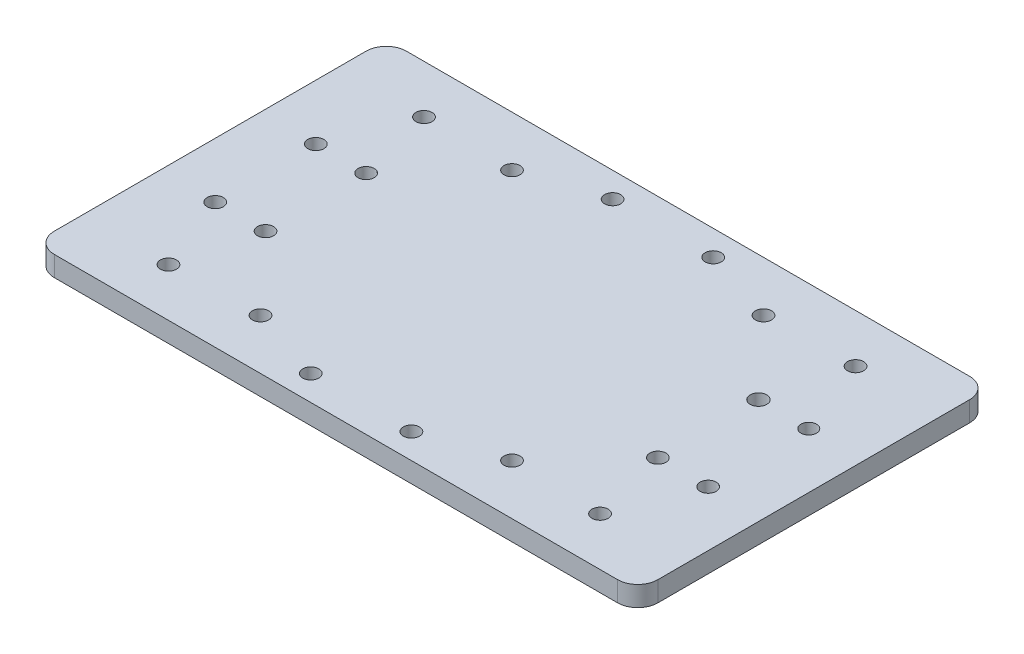
ISO-10303-21;
HEADER;
FILE_DESCRIPTION(('STEP AP214'),'2;1');
FILE_NAME('part.step','',(''),(''),'','','');
FILE_SCHEMA(('AUTOMOTIVE_DESIGN { 1 0 10303 214 1 1 1 1 }'));
ENDSEC;
DATA;
#1=APPLICATION_CONTEXT('core data for automotive mechanical design processes');
#2=APPLICATION_PROTOCOL_DEFINITION('international standard','automotive_design',2000,#1);
#3=PRODUCT_CONTEXT('',#1,'mechanical');
#4=PRODUCT('Part','Part','',(#3));
#5=PRODUCT_RELATED_PRODUCT_CATEGORY('part','',(#4));
#6=PRODUCT_DEFINITION_FORMATION('','',#4);
#7=PRODUCT_DEFINITION_CONTEXT('part definition',#1,'design');
#8=PRODUCT_DEFINITION('design','',#6,#7);
#9=PRODUCT_DEFINITION_SHAPE('','',#8);
#10=(LENGTH_UNIT() NAMED_UNIT(*) SI_UNIT(.MILLI.,.METRE.));
#11=(NAMED_UNIT(*) PLANE_ANGLE_UNIT() SI_UNIT($,.RADIAN.));
#12=(NAMED_UNIT(*) SI_UNIT($,.STERADIAN.) SOLID_ANGLE_UNIT());
#13=UNCERTAINTY_MEASURE_WITH_UNIT(LENGTH_MEASURE(1.E-05),#10,'distance_accuracy_value','');
#14=(GEOMETRIC_REPRESENTATION_CONTEXT(3) GLOBAL_UNCERTAINTY_ASSIGNED_CONTEXT((#13)) GLOBAL_UNIT_ASSIGNED_CONTEXT((#10,
#11,#12)) REPRESENTATION_CONTEXT('',''));
#15=CARTESIAN_POINT('',(0.,0.,0.));
#16=DIRECTION('',(0.,0.,1.));
#17=DIRECTION('',(1.,0.,0.));
#18=AXIS2_PLACEMENT_3D('',#15,#16,#17);
#19=CARTESIAN_POINT('',(0.,4.,0.));
#20=DIRECTION('',(1.,0.,0.));
#21=DIRECTION('',(0.,0.,-1.));
#22=AXIS2_PLACEMENT_3D('',#19,#20,#21);
#23=PLANE('',#22);
#24=DIRECTION('',(0.,0.,1.));
#25=VECTOR('',#24,1.);
#26=CARTESIAN_POINT('',(0.,4.,0.));
#27=LINE('',#26,#25);
#28=CARTESIAN_POINT('',(0.,4.,-66.));
#29=VERTEX_POINT('',#28);
#30=CARTESIAN_POINT('',(0.,4.,-4.));
#31=VERTEX_POINT('',#30);
#32=EDGE_CURVE('E128',#29,#31,#27,.T.);
#33=ORIENTED_EDGE('',*,*,#32,.F.);
#34=DIRECTION('',(0.,-1.,0.));
#35=VECTOR('',#34,1.);
#36=CARTESIAN_POINT('',(0.,4.,-66.));
#37=LINE('',#36,#35);
#38=CARTESIAN_POINT('',(0.,0.,-66.));
#39=VERTEX_POINT('',#38);
#40=EDGE_CURVE('E113',#29,#39,#37,.T.);
#41=ORIENTED_EDGE('',*,*,#40,.T.);
#42=DIRECTION('',(0.,0.,1.));
#43=VECTOR('',#42,1.);
#44=CARTESIAN_POINT('',(0.,0.,0.));
#45=LINE('',#44,#43);
#46=CARTESIAN_POINT('',(0.,0.,-4.));
#47=VERTEX_POINT('',#46);
#48=EDGE_CURVE('E125',#39,#47,#45,.T.);
#49=ORIENTED_EDGE('',*,*,#48,.T.);
#50=DIRECTION('',(0.,-1.,0.));
#51=VECTOR('',#50,1.);
#52=CARTESIAN_POINT('',(0.,4.,-4.));
#53=LINE('',#52,#51);
#54=EDGE_CURVE('E130',#47,#31,#53,.F.);
#55=ORIENTED_EDGE('',*,*,#54,.T.);
#56=EDGE_LOOP('',(#33,#41,#49,#55));
#57=FACE_BOUND('',#56,.T.);
#58=ADVANCED_FACE('F43',(#57),#23,.F.);
#59=CARTESIAN_POINT('',(0.,4.,0.));
#60=DIRECTION('',(0.,0.,-1.));
#61=DIRECTION('',(-1.,0.,0.));
#62=AXIS2_PLACEMENT_3D('',#59,#60,#61);
#63=PLANE('',#62);
#64=DIRECTION('',(1.,0.,0.));
#65=VECTOR('',#64,1.);
#66=CARTESIAN_POINT('',(0.,0.,0.));
#67=LINE('',#66,#65);
#68=CARTESIAN_POINT('',(4.,0.,0.));
#69=VERTEX_POINT('',#68);
#70=CARTESIAN_POINT('',(116.,0.,0.));
#71=VERTEX_POINT('',#70);
#72=EDGE_CURVE('E134',#69,#71,#67,.T.);
#73=ORIENTED_EDGE('',*,*,#72,.T.);
#74=DIRECTION('',(0.,-1.,0.));
#75=VECTOR('',#74,1.);
#76=CARTESIAN_POINT('',(116.,4.,0.));
#77=LINE('',#76,#75);
#78=CARTESIAN_POINT('',(116.,4.,0.));
#79=VERTEX_POINT('',#78);
#80=EDGE_CURVE('E11',#71,#79,#77,.F.);
#81=ORIENTED_EDGE('',*,*,#80,.T.);
#82=DIRECTION('',(1.,0.,0.));
#83=VECTOR('',#82,1.);
#84=CARTESIAN_POINT('',(0.,4.,0.));
#85=LINE('',#84,#83);
#86=CARTESIAN_POINT('',(4.,4.,0.));
#87=VERTEX_POINT('',#86);
#88=EDGE_CURVE('E174',#87,#79,#85,.T.);
#89=ORIENTED_EDGE('',*,*,#88,.F.);
#90=DIRECTION('',(0.,-1.,0.));
#91=VECTOR('',#90,1.);
#92=CARTESIAN_POINT('',(4.,4.,0.));
#93=LINE('',#92,#91);
#94=EDGE_CURVE('E51',#87,#69,#93,.T.);
#95=ORIENTED_EDGE('',*,*,#94,.T.);
#96=EDGE_LOOP('',(#73,#81,#89,#95));
#97=FACE_BOUND('',#96,.T.);
#98=ADVANCED_FACE('F172',(#97),#63,.F.);
#99=CARTESIAN_POINT('',(120.,4.,0.));
#100=DIRECTION('',(-1.,0.,0.));
#101=DIRECTION('',(0.,0.,1.));
#102=AXIS2_PLACEMENT_3D('',#99,#100,#101);
#103=PLANE('',#102);
#104=DIRECTION('',(0.,0.,-1.));
#105=VECTOR('',#104,1.);
#106=CARTESIAN_POINT('',(120.,0.,0.));
#107=LINE('',#106,#105);
#108=CARTESIAN_POINT('',(120.,0.,-4.));
#109=VERTEX_POINT('',#108);
#110=CARTESIAN_POINT('',(120.,0.,-66.));
#111=VERTEX_POINT('',#110);
#112=EDGE_CURVE('E138',#109,#111,#107,.T.);
#113=ORIENTED_EDGE('',*,*,#112,.T.);
#114=DIRECTION('',(0.,-1.,0.));
#115=VECTOR('',#114,1.);
#116=CARTESIAN_POINT('',(120.,4.,-66.));
#117=LINE('',#116,#115);
#118=CARTESIAN_POINT('',(120.,4.,-66.));
#119=VERTEX_POINT('',#118);
#120=EDGE_CURVE('E58',#111,#119,#117,.F.);
#121=ORIENTED_EDGE('',*,*,#120,.T.);
#122=DIRECTION('',(0.,0.,-1.));
#123=VECTOR('',#122,1.);
#124=CARTESIAN_POINT('',(120.,4.,0.));
#125=LINE('',#124,#123);
#126=CARTESIAN_POINT('',(120.,4.,-4.));
#127=VERTEX_POINT('',#126);
#128=EDGE_CURVE('E182',#127,#119,#125,.T.);
#129=ORIENTED_EDGE('',*,*,#128,.F.);
#130=DIRECTION('',(0.,-1.,0.));
#131=VECTOR('',#130,1.);
#132=CARTESIAN_POINT('',(120.,4.,-4.));
#133=LINE('',#132,#131);
#134=EDGE_CURVE('E165',#127,#109,#133,.T.);
#135=ORIENTED_EDGE('',*,*,#134,.T.);
#136=EDGE_LOOP('',(#113,#121,#129,#135));
#137=FACE_BOUND('',#136,.T.);
#138=ADVANCED_FACE('F181',(#137),#103,.F.);
#139=CARTESIAN_POINT('',(0.,4.,-70.));
#140=DIRECTION('',(0.,0.,1.));
#141=DIRECTION('',(1.,0.,0.));
#142=AXIS2_PLACEMENT_3D('',#139,#140,#141);
#143=PLANE('',#142);
#144=DIRECTION('',(-1.,0.,0.));
#145=VECTOR('',#144,1.);
#146=CARTESIAN_POINT('',(0.,0.,-70.));
#147=LINE('',#146,#145);
#148=CARTESIAN_POINT('',(116.,0.,-70.));
#149=VERTEX_POINT('',#148);
#150=CARTESIAN_POINT('',(4.,0.,-70.));
#151=VERTEX_POINT('',#150);
#152=EDGE_CURVE('E148',#149,#151,#147,.T.);
#153=ORIENTED_EDGE('',*,*,#152,.T.);
#154=DIRECTION('',(0.,-1.,0.));
#155=VECTOR('',#154,1.);
#156=CARTESIAN_POINT('',(4.,4.,-70.));
#157=LINE('',#156,#155);
#158=CARTESIAN_POINT('',(4.,4.,-70.));
#159=VERTEX_POINT('',#158);
#160=EDGE_CURVE('E114',#151,#159,#157,.F.);
#161=ORIENTED_EDGE('',*,*,#160,.T.);
#162=DIRECTION('',(-1.,0.,0.));
#163=VECTOR('',#162,1.);
#164=CARTESIAN_POINT('',(0.,4.,-70.));
#165=LINE('',#164,#163);
#166=CARTESIAN_POINT('',(116.,4.,-70.));
#167=VERTEX_POINT('',#166);
#168=EDGE_CURVE('E144',#167,#159,#165,.T.);
#169=ORIENTED_EDGE('',*,*,#168,.F.);
#170=DIRECTION('',(0.,-1.,0.));
#171=VECTOR('',#170,1.);
#172=CARTESIAN_POINT('',(116.,4.,-70.));
#173=LINE('',#172,#171);
#174=EDGE_CURVE('E119',#167,#149,#173,.T.);
#175=ORIENTED_EDGE('',*,*,#174,.T.);
#176=EDGE_LOOP('',(#153,#161,#169,#175));
#177=FACE_BOUND('',#176,.T.);
#178=ADVANCED_FACE('F310',(#177),#143,.F.);
#179=CARTESIAN_POINT('',(0.,4.,0.));
#180=DIRECTION('',(0.,-1.,0.));
#181=DIRECTION('',(0.,0.,-1.));
#182=AXIS2_PLACEMENT_3D('',#179,#180,#181);
#183=PLANE('',#182);
#184=CARTESIAN_POINT('',(70.,4.,-5.));
#185=DIRECTION('',(0.,1.,0.));
#186=DIRECTION('',(0.,0.,1.));
#187=AXIS2_PLACEMENT_3D('',#184,#185,#186);
#188=CIRCLE('',#187,1.60000000000001);
#189=CARTESIAN_POINT('',(70.,4.,-3.4));
#190=VERTEX_POINT('',#189);
#191=EDGE_CURVE('E284',#190,#190,#188,.T.);
#192=ORIENTED_EDGE('',*,*,#191,.F.);
#193=EDGE_LOOP('',(#192));
#194=FACE_BOUND('',#193,.T.);
#195=CARTESIAN_POINT('',(50.,4.,-65.));
#196=DIRECTION('',(0.,1.,0.));
#197=DIRECTION('',(0.,0.,1.));
#198=AXIS2_PLACEMENT_3D('',#195,#196,#197);
#199=CIRCLE('',#198,1.6);
#200=CARTESIAN_POINT('',(50.,4.,-63.4));
#201=VERTEX_POINT('',#200);
#202=EDGE_CURVE('E290',#201,#201,#199,.T.);
#203=ORIENTED_EDGE('',*,*,#202,.F.);
#204=EDGE_LOOP('',(#203));
#205=FACE_BOUND('',#204,.T.);
#206=CARTESIAN_POINT('',(70.,4.,-65.));
#207=DIRECTION('',(0.,1.,0.));
#208=DIRECTION('',(0.,0.,1.));
#209=AXIS2_PLACEMENT_3D('',#206,#207,#208);
#210=CIRCLE('',#209,1.60000000000001);
#211=CARTESIAN_POINT('',(70.,4.,-63.4));
#212=VERTEX_POINT('',#211);
#213=EDGE_CURVE('E291',#212,#212,#210,.T.);
#214=ORIENTED_EDGE('',*,*,#213,.F.);
#215=EDGE_LOOP('',(#214));
#216=FACE_BOUND('',#215,.T.);
#217=CARTESIAN_POINT('',(50.,4.,-5.));
#218=DIRECTION('',(0.,1.,0.));
#219=DIRECTION('',(0.,0.,1.));
#220=AXIS2_PLACEMENT_3D('',#217,#218,#219);
#221=CIRCLE('',#220,1.6);
#222=CARTESIAN_POINT('',(50.,4.,-3.4));
#223=VERTEX_POINT('',#222);
#224=EDGE_CURVE('E281',#223,#223,#221,.T.);
#225=ORIENTED_EDGE('',*,*,#224,.F.);
#226=EDGE_LOOP('',(#225));
#227=FACE_BOUND('',#226,.T.);
#228=CARTESIAN_POINT('',(99.,4.,-45.));
#229=DIRECTION('',(0.,1.,0.));
#230=DIRECTION('',(0.,0.,1.));
#231=AXIS2_PLACEMENT_3D('',#228,#229,#230);
#232=CIRCLE('',#231,1.65);
#233=CARTESIAN_POINT('',(99.,4.,-43.35));
#234=VERTEX_POINT('',#233);
#235=EDGE_CURVE('E207',#234,#234,#232,.T.);
#236=ORIENTED_EDGE('',*,*,#235,.F.);
#237=EDGE_LOOP('',(#236));
#238=FACE_BOUND('',#237,.T.);
#239=CARTESIAN_POINT('',(109.,4.,-25.));
#240=DIRECTION('',(0.,1.,0.));
#241=DIRECTION('',(0.,0.,1.));
#242=AXIS2_PLACEMENT_3D('',#239,#240,#241);
#243=CIRCLE('',#242,1.59999999999999);
#244=CARTESIAN_POINT('',(109.,4.,-23.4));
#245=VERTEX_POINT('',#244);
#246=EDGE_CURVE('E218',#245,#245,#243,.T.);
#247=ORIENTED_EDGE('',*,*,#246,.F.);
#248=EDGE_LOOP('',(#247));
#249=FACE_BOUND('',#248,.T.);
#250=CARTESIAN_POINT('',(99.,4.,-25.));
#251=DIRECTION('',(0.,1.,0.));
#252=DIRECTION('',(0.,0.,1.));
#253=AXIS2_PLACEMENT_3D('',#250,#251,#252);
#254=CIRCLE('',#253,1.6);
#255=CARTESIAN_POINT('',(99.,4.,-23.4));
#256=VERTEX_POINT('',#255);
#257=EDGE_CURVE('E219',#256,#256,#254,.T.);
#258=ORIENTED_EDGE('',*,*,#257,.F.);
#259=EDGE_LOOP('',(#258));
#260=FACE_BOUND('',#259,.T.);
#261=CARTESIAN_POINT('',(102.9,4.,-9.6));
#262=DIRECTION('',(0.,1.,0.));
#263=DIRECTION('',(0.,0.,1.));
#264=AXIS2_PLACEMENT_3D('',#261,#262,#263);
#265=CIRCLE('',#264,1.60000000000002);
#266=CARTESIAN_POINT('',(102.9,4.,-7.99999999999998));
#267=VERTEX_POINT('',#266);
#268=EDGE_CURVE('E230',#267,#267,#265,.T.);
#269=ORIENTED_EDGE('',*,*,#268,.F.);
#270=EDGE_LOOP('',(#269));
#271=FACE_BOUND('',#270,.T.);
#272=CARTESIAN_POINT('',(21.,4.,-45.));
#273=DIRECTION('',(0.,1.,0.));
#274=DIRECTION('',(0.,0.,1.));
#275=AXIS2_PLACEMENT_3D('',#272,#273,#274);
#276=CIRCLE('',#275,1.6);
#277=CARTESIAN_POINT('',(21.,4.,-43.4));
#278=VERTEX_POINT('',#277);
#279=EDGE_CURVE('E189',#278,#278,#276,.T.);
#280=ORIENTED_EDGE('',*,*,#279,.F.);
#281=EDGE_LOOP('',(#280));
#282=FACE_BOUND('',#281,.T.);
#283=CARTESIAN_POINT('',(21.,4.,-25.));
#284=DIRECTION('',(0.,1.,0.));
#285=DIRECTION('',(0.,0.,1.));
#286=AXIS2_PLACEMENT_3D('',#283,#284,#285);
#287=CIRCLE('',#286,1.6);
#288=CARTESIAN_POINT('',(21.,4.,-23.4));
#289=VERTEX_POINT('',#288);
#290=EDGE_CURVE('E194',#289,#289,#287,.T.);
#291=ORIENTED_EDGE('',*,*,#290,.F.);
#292=EDGE_LOOP('',(#291));
#293=FACE_BOUND('',#292,.T.);
#294=CARTESIAN_POINT('',(11.,4.,-25.));
#295=DIRECTION('',(0.,1.,0.));
#296=DIRECTION('',(0.,0.,1.));
#297=AXIS2_PLACEMENT_3D('',#294,#295,#296);
#298=CIRCLE('',#297,1.6);
#299=CARTESIAN_POINT('',(11.,4.,-23.4));
#300=VERTEX_POINT('',#299);
#301=EDGE_CURVE('E195',#300,#300,#298,.T.);
#302=ORIENTED_EDGE('',*,*,#301,.F.);
#303=EDGE_LOOP('',(#302));
#304=FACE_BOUND('',#303,.T.);
#305=CARTESIAN_POINT('',(109.,4.,-45.));
#306=DIRECTION('',(0.,1.,0.));
#307=DIRECTION('',(0.,0.,1.));
#308=AXIS2_PLACEMENT_3D('',#305,#306,#307);
#309=CIRCLE('',#308,1.54999999999999);
#310=CARTESIAN_POINT('',(109.,4.,-43.45));
#311=VERTEX_POINT('',#310);
#312=EDGE_CURVE('E206',#311,#311,#309,.T.);
#313=ORIENTED_EDGE('',*,*,#312,.F.);
#314=EDGE_LOOP('',(#313));
#315=FACE_BOUND('',#314,.T.);
#316=CARTESIAN_POINT('',(35.,4.,-60.));
#317=DIRECTION('',(0.,1.,0.));
#318=DIRECTION('',(0.,0.,1.));
#319=AXIS2_PLACEMENT_3D('',#316,#317,#318);
#320=CIRCLE('',#319,1.6);
#321=CARTESIAN_POINT('',(35.,4.,-58.4));
#322=VERTEX_POINT('',#321);
#323=EDGE_CURVE('E266',#322,#322,#320,.T.);
#324=ORIENTED_EDGE('',*,*,#323,.F.);
#325=EDGE_LOOP('',(#324));
#326=FACE_BOUND('',#325,.T.);
#327=CARTESIAN_POINT('',(35.,4.,-10.));
#328=DIRECTION('',(0.,1.,0.));
#329=DIRECTION('',(0.,0.,1.));
#330=AXIS2_PLACEMENT_3D('',#327,#328,#329);
#331=CIRCLE('',#330,1.6);
#332=CARTESIAN_POINT('',(35.,4.,-8.4));
#333=VERTEX_POINT('',#332);
#334=EDGE_CURVE('E273',#333,#333,#331,.T.);
#335=ORIENTED_EDGE('',*,*,#334,.F.);
#336=EDGE_LOOP('',(#335));
#337=FACE_BOUND('',#336,.T.);
#338=CARTESIAN_POINT('',(85.,4.,-10.));
#339=DIRECTION('',(0.,1.,0.));
#340=DIRECTION('',(0.,0.,1.));
#341=AXIS2_PLACEMENT_3D('',#338,#339,#340);
#342=CIRCLE('',#341,1.6);
#343=CARTESIAN_POINT('',(85.,4.,-8.4));
#344=VERTEX_POINT('',#343);
#345=EDGE_CURVE('E243',#344,#344,#342,.T.);
#346=ORIENTED_EDGE('',*,*,#345,.F.);
#347=EDGE_LOOP('',(#346));
#348=FACE_BOUND('',#347,.T.);
#349=CARTESIAN_POINT('',(85.,4.,-60.));
#350=DIRECTION('',(0.,1.,0.));
#351=DIRECTION('',(0.,0.,1.));
#352=AXIS2_PLACEMENT_3D('',#349,#350,#351);
#353=CIRCLE('',#352,1.60000000000001);
#354=CARTESIAN_POINT('',(85.,4.,-58.4));
#355=VERTEX_POINT('',#354);
#356=EDGE_CURVE('E242',#355,#355,#353,.T.);
#357=ORIENTED_EDGE('',*,*,#356,.F.);
#358=EDGE_LOOP('',(#357));
#359=FACE_BOUND('',#358,.T.);
#360=CARTESIAN_POINT('',(102.9,4.,-60.4));
#361=DIRECTION('',(0.,1.,0.));
#362=DIRECTION('',(0.,0.,1.));
#363=AXIS2_PLACEMENT_3D('',#360,#361,#362);
#364=CIRCLE('',#363,1.60000000000002);
#365=CARTESIAN_POINT('',(102.9,4.,-58.8));
#366=VERTEX_POINT('',#365);
#367=EDGE_CURVE('E249',#366,#366,#364,.T.);
#368=ORIENTED_EDGE('',*,*,#367,.F.);
#369=EDGE_LOOP('',(#368));
#370=FACE_BOUND('',#369,.T.);
#371=CARTESIAN_POINT('',(17.1,4.,-60.4));
#372=DIRECTION('',(0.,1.,0.));
#373=DIRECTION('',(0.,0.,1.));
#374=AXIS2_PLACEMENT_3D('',#371,#372,#373);
#375=CIRCLE('',#374,1.6);
#376=CARTESIAN_POINT('',(17.1,4.,-58.8));
#377=VERTEX_POINT('',#376);
#378=EDGE_CURVE('E255',#377,#377,#375,.T.);
#379=ORIENTED_EDGE('',*,*,#378,.F.);
#380=EDGE_LOOP('',(#379));
#381=FACE_BOUND('',#380,.T.);
#382=CARTESIAN_POINT('',(17.1,4.,-9.6));
#383=DIRECTION('',(0.,1.,0.));
#384=DIRECTION('',(0.,0.,1.));
#385=AXIS2_PLACEMENT_3D('',#382,#383,#384);
#386=CIRCLE('',#385,1.6);
#387=CARTESIAN_POINT('',(17.1,4.,-8.00000000000001));
#388=VERTEX_POINT('',#387);
#389=EDGE_CURVE('E231',#388,#388,#386,.T.);
#390=ORIENTED_EDGE('',*,*,#389,.F.);
#391=EDGE_LOOP('',(#390));
#392=FACE_BOUND('',#391,.T.);
#393=CARTESIAN_POINT('',(11.,4.,-45.));
#394=DIRECTION('',(0.,1.,0.));
#395=DIRECTION('',(0.,0.,1.));
#396=AXIS2_PLACEMENT_3D('',#393,#394,#395);
#397=CIRCLE('',#396,1.6);
#398=CARTESIAN_POINT('',(11.,4.,-43.4));
#399=VERTEX_POINT('',#398);
#400=EDGE_CURVE('E141',#399,#399,#397,.T.);
#401=ORIENTED_EDGE('',*,*,#400,.F.);
#402=EDGE_LOOP('',(#401));
#403=FACE_BOUND('',#402,.T.);
#404=ORIENTED_EDGE('',*,*,#168,.T.);
#405=CARTESIAN_POINT('',(4.,4.,-66.));
#406=DIRECTION('',(0.,-1.,0.));
#407=DIRECTION('',(0.,0.,-1.));
#408=AXIS2_PLACEMENT_3D('',#405,#406,#407);
#409=CIRCLE('',#408,4.);
#410=EDGE_CURVE('E163',#159,#29,#409,.F.);
#411=ORIENTED_EDGE('',*,*,#410,.T.);
#412=ORIENTED_EDGE('',*,*,#32,.T.);
#413=CARTESIAN_POINT('',(4.,4.,-4.));
#414=DIRECTION('',(0.,-1.,0.));
#415=DIRECTION('',(0.,0.,-1.));
#416=AXIS2_PLACEMENT_3D('',#413,#414,#415);
#417=CIRCLE('',#416,4.);
#418=EDGE_CURVE('E158',#31,#87,#417,.F.);
#419=ORIENTED_EDGE('',*,*,#418,.T.);
#420=ORIENTED_EDGE('',*,*,#88,.T.);
#421=CARTESIAN_POINT('',(116.,4.,-4.));
#422=DIRECTION('',(0.,-1.,0.));
#423=DIRECTION('',(0.,0.,-1.));
#424=AXIS2_PLACEMENT_3D('',#421,#422,#423);
#425=CIRCLE('',#424,4.);
#426=EDGE_CURVE('E65',#79,#127,#425,.F.);
#427=ORIENTED_EDGE('',*,*,#426,.T.);
#428=ORIENTED_EDGE('',*,*,#128,.T.);
#429=CARTESIAN_POINT('',(116.,4.,-66.));
#430=DIRECTION('',(0.,-1.,0.));
#431=DIRECTION('',(0.,0.,-1.));
#432=AXIS2_PLACEMENT_3D('',#429,#430,#431);
#433=CIRCLE('',#432,4.);
#434=EDGE_CURVE('E161',#119,#167,#433,.F.);
#435=ORIENTED_EDGE('',*,*,#434,.T.);
#436=EDGE_LOOP('',(#404,#411,#412,#419,#420,#427,#428,#435));
#437=FACE_BOUND('',#436,.T.);
#438=ADVANCED_FACE('F307',(#194,#205,#216,#227,#238,#249,#260,#271,#282,#293,#304,#315,#326,
#337,#348,#359,#370,#381,#392,#403,#437),#183,.F.);
#439=CARTESIAN_POINT('',(0.,0.,0.));
#440=DIRECTION('',(0.,-1.,0.));
#441=DIRECTION('',(0.,0.,-1.));
#442=AXIS2_PLACEMENT_3D('',#439,#440,#441);
#443=PLANE('',#442);
#444=CARTESIAN_POINT('',(70.,0.,-5.));
#445=DIRECTION('',(0.,1.,0.));
#446=DIRECTION('',(0.,0.,1.));
#447=AXIS2_PLACEMENT_3D('',#444,#445,#446);
#448=CIRCLE('',#447,1.60000000000001);
#449=CARTESIAN_POINT('',(70.,0.,-3.4));
#450=VERTEX_POINT('',#449);
#451=EDGE_CURVE('E294',#450,#450,#448,.T.);
#452=ORIENTED_EDGE('',*,*,#451,.T.);
#453=EDGE_LOOP('',(#452));
#454=FACE_BOUND('',#453,.T.);
#455=CARTESIAN_POINT('',(50.,0.,-65.));
#456=DIRECTION('',(0.,1.,0.));
#457=DIRECTION('',(0.,0.,1.));
#458=AXIS2_PLACEMENT_3D('',#455,#456,#457);
#459=CIRCLE('',#458,1.6);
#460=CARTESIAN_POINT('',(50.,0.,-63.4));
#461=VERTEX_POINT('',#460);
#462=EDGE_CURVE('E287',#461,#461,#459,.T.);
#463=ORIENTED_EDGE('',*,*,#462,.T.);
#464=EDGE_LOOP('',(#463));
#465=FACE_BOUND('',#464,.T.);
#466=CARTESIAN_POINT('',(70.,0.,-65.));
#467=DIRECTION('',(0.,1.,0.));
#468=DIRECTION('',(0.,0.,1.));
#469=AXIS2_PLACEMENT_3D('',#466,#467,#468);
#470=CIRCLE('',#469,1.60000000000001);
#471=CARTESIAN_POINT('',(70.,0.,-63.4));
#472=VERTEX_POINT('',#471);
#473=EDGE_CURVE('E299',#472,#472,#470,.T.);
#474=ORIENTED_EDGE('',*,*,#473,.T.);
#475=EDGE_LOOP('',(#474));
#476=FACE_BOUND('',#475,.T.);
#477=CARTESIAN_POINT('',(50.,0.,-5.));
#478=DIRECTION('',(0.,1.,0.));
#479=DIRECTION('',(0.,0.,1.));
#480=AXIS2_PLACEMENT_3D('',#477,#478,#479);
#481=CIRCLE('',#480,1.6);
#482=CARTESIAN_POINT('',(50.,0.,-3.4));
#483=VERTEX_POINT('',#482);
#484=EDGE_CURVE('E267',#483,#483,#481,.T.);
#485=ORIENTED_EDGE('',*,*,#484,.T.);
#486=EDGE_LOOP('',(#485));
#487=FACE_BOUND('',#486,.T.);
#488=CARTESIAN_POINT('',(99.,0.,-45.));
#489=DIRECTION('',(0.,1.,0.));
#490=DIRECTION('',(0.,0.,1.));
#491=AXIS2_PLACEMENT_3D('',#488,#489,#490);
#492=CIRCLE('',#491,1.65);
#493=CARTESIAN_POINT('',(99.,0.,-43.35));
#494=VERTEX_POINT('',#493);
#495=EDGE_CURVE('E222',#494,#494,#492,.T.);
#496=ORIENTED_EDGE('',*,*,#495,.T.);
#497=EDGE_LOOP('',(#496));
#498=FACE_BOUND('',#497,.T.);
#499=CARTESIAN_POINT('',(109.,0.,-25.));
#500=DIRECTION('',(0.,1.,0.));
#501=DIRECTION('',(0.,0.,1.));
#502=AXIS2_PLACEMENT_3D('',#499,#500,#501);
#503=CIRCLE('',#502,1.59999999999999);
#504=CARTESIAN_POINT('',(109.,0.,-23.4));
#505=VERTEX_POINT('',#504);
#506=EDGE_CURVE('E215',#505,#505,#503,.T.);
#507=ORIENTED_EDGE('',*,*,#506,.T.);
#508=EDGE_LOOP('',(#507));
#509=FACE_BOUND('',#508,.T.);
#510=CARTESIAN_POINT('',(99.,0.,-25.));
#511=DIRECTION('',(0.,1.,0.));
#512=DIRECTION('',(0.,0.,1.));
#513=AXIS2_PLACEMENT_3D('',#510,#511,#512);
#514=CIRCLE('',#513,1.6);
#515=CARTESIAN_POINT('',(99.,0.,-23.4));
#516=VERTEX_POINT('',#515);
#517=EDGE_CURVE('E234',#516,#516,#514,.T.);
#518=ORIENTED_EDGE('',*,*,#517,.T.);
#519=EDGE_LOOP('',(#518));
#520=FACE_BOUND('',#519,.T.);
#521=CARTESIAN_POINT('',(102.9,0.,-9.6));
#522=DIRECTION('',(0.,1.,0.));
#523=DIRECTION('',(0.,0.,1.));
#524=AXIS2_PLACEMENT_3D('',#521,#522,#523);
#525=CIRCLE('',#524,1.60000000000002);
#526=CARTESIAN_POINT('',(102.9,0.,-7.99999999999998));
#527=VERTEX_POINT('',#526);
#528=EDGE_CURVE('E227',#527,#527,#525,.T.);
#529=ORIENTED_EDGE('',*,*,#528,.T.);
#530=EDGE_LOOP('',(#529));
#531=FACE_BOUND('',#530,.T.);
#532=CARTESIAN_POINT('',(21.,0.,-45.));
#533=DIRECTION('',(0.,1.,0.));
#534=DIRECTION('',(0.,0.,1.));
#535=AXIS2_PLACEMENT_3D('',#532,#533,#534);
#536=CIRCLE('',#535,1.6);
#537=CARTESIAN_POINT('',(21.,0.,-43.4));
#538=VERTEX_POINT('',#537);
#539=EDGE_CURVE('E198',#538,#538,#536,.T.);
#540=ORIENTED_EDGE('',*,*,#539,.T.);
#541=EDGE_LOOP('',(#540));
#542=FACE_BOUND('',#541,.T.);
#543=CARTESIAN_POINT('',(21.,0.,-25.));
#544=DIRECTION('',(0.,1.,0.));
#545=DIRECTION('',(0.,0.,1.));
#546=AXIS2_PLACEMENT_3D('',#543,#544,#545);
#547=CIRCLE('',#546,1.6);
#548=CARTESIAN_POINT('',(21.,0.,-23.4));
#549=VERTEX_POINT('',#548);
#550=EDGE_CURVE('E191',#549,#549,#547,.T.);
#551=ORIENTED_EDGE('',*,*,#550,.T.);
#552=EDGE_LOOP('',(#551));
#553=FACE_BOUND('',#552,.T.);
#554=CARTESIAN_POINT('',(11.,0.,-25.));
#555=DIRECTION('',(0.,1.,0.));
#556=DIRECTION('',(0.,0.,1.));
#557=AXIS2_PLACEMENT_3D('',#554,#555,#556);
#558=CIRCLE('',#557,1.6);
#559=CARTESIAN_POINT('',(11.,0.,-23.4));
#560=VERTEX_POINT('',#559);
#561=EDGE_CURVE('E210',#560,#560,#558,.T.);
#562=ORIENTED_EDGE('',*,*,#561,.T.);
#563=EDGE_LOOP('',(#562));
#564=FACE_BOUND('',#563,.T.);
#565=CARTESIAN_POINT('',(109.,0.,-45.));
#566=DIRECTION('',(0.,1.,0.));
#567=DIRECTION('',(0.,0.,1.));
#568=AXIS2_PLACEMENT_3D('',#565,#566,#567);
#569=CIRCLE('',#568,1.54999999999999);
#570=CARTESIAN_POINT('',(109.,0.,-43.45));
#571=VERTEX_POINT('',#570);
#572=EDGE_CURVE('E203',#571,#571,#569,.T.);
#573=ORIENTED_EDGE('',*,*,#572,.T.);
#574=EDGE_LOOP('',(#573));
#575=FACE_BOUND('',#574,.T.);
#576=CARTESIAN_POINT('',(35.,0.,-60.));
#577=DIRECTION('',(0.,1.,0.));
#578=DIRECTION('',(0.,0.,1.));
#579=AXIS2_PLACEMENT_3D('',#576,#577,#578);
#580=CIRCLE('',#579,1.6);
#581=CARTESIAN_POINT('',(35.,0.,-58.4));
#582=VERTEX_POINT('',#581);
#583=EDGE_CURVE('E263',#582,#582,#580,.T.);
#584=ORIENTED_EDGE('',*,*,#583,.T.);
#585=EDGE_LOOP('',(#584));
#586=FACE_BOUND('',#585,.T.);
#587=CARTESIAN_POINT('',(35.,0.,-10.));
#588=DIRECTION('',(0.,1.,0.));
#589=DIRECTION('',(0.,0.,1.));
#590=AXIS2_PLACEMENT_3D('',#587,#588,#589);
#591=CIRCLE('',#590,1.6);
#592=CARTESIAN_POINT('',(35.,0.,-8.4));
#593=VERTEX_POINT('',#592);
#594=EDGE_CURVE('E270',#593,#593,#591,.T.);
#595=ORIENTED_EDGE('',*,*,#594,.T.);
#596=EDGE_LOOP('',(#595));
#597=FACE_BOUND('',#596,.T.);
#598=CARTESIAN_POINT('',(85.,0.,-10.));
#599=DIRECTION('',(0.,1.,0.));
#600=DIRECTION('',(0.,0.,1.));
#601=AXIS2_PLACEMENT_3D('',#598,#599,#600);
#602=CIRCLE('',#601,1.6);
#603=CARTESIAN_POINT('',(85.,0.,-8.4));
#604=VERTEX_POINT('',#603);
#605=EDGE_CURVE('E276',#604,#604,#602,.T.);
#606=ORIENTED_EDGE('',*,*,#605,.T.);
#607=EDGE_LOOP('',(#606));
#608=FACE_BOUND('',#607,.T.);
#609=CARTESIAN_POINT('',(85.,0.,-60.));
#610=DIRECTION('',(0.,1.,0.));
#611=DIRECTION('',(0.,0.,1.));
#612=AXIS2_PLACEMENT_3D('',#609,#610,#611);
#613=CIRCLE('',#612,1.60000000000001);
#614=CARTESIAN_POINT('',(85.,0.,-58.4));
#615=VERTEX_POINT('',#614);
#616=EDGE_CURVE('E239',#615,#615,#613,.T.);
#617=ORIENTED_EDGE('',*,*,#616,.T.);
#618=EDGE_LOOP('',(#617));
#619=FACE_BOUND('',#618,.T.);
#620=CARTESIAN_POINT('',(102.9,0.,-60.4));
#621=DIRECTION('',(0.,1.,0.));
#622=DIRECTION('',(0.,0.,1.));
#623=AXIS2_PLACEMENT_3D('',#620,#621,#622);
#624=CIRCLE('',#623,1.60000000000002);
#625=CARTESIAN_POINT('',(102.9,0.,-58.8));
#626=VERTEX_POINT('',#625);
#627=EDGE_CURVE('E246',#626,#626,#624,.T.);
#628=ORIENTED_EDGE('',*,*,#627,.T.);
#629=EDGE_LOOP('',(#628));
#630=FACE_BOUND('',#629,.T.);
#631=CARTESIAN_POINT('',(17.1,0.,-60.4));
#632=DIRECTION('',(0.,1.,0.));
#633=DIRECTION('',(0.,0.,1.));
#634=AXIS2_PLACEMENT_3D('',#631,#632,#633);
#635=CIRCLE('',#634,1.6);
#636=CARTESIAN_POINT('',(17.1,0.,-58.8));
#637=VERTEX_POINT('',#636);
#638=EDGE_CURVE('E252',#637,#637,#635,.T.);
#639=ORIENTED_EDGE('',*,*,#638,.T.);
#640=EDGE_LOOP('',(#639));
#641=FACE_BOUND('',#640,.T.);
#642=CARTESIAN_POINT('',(17.1,0.,-9.6));
#643=DIRECTION('',(0.,1.,0.));
#644=DIRECTION('',(0.,0.,1.));
#645=AXIS2_PLACEMENT_3D('',#642,#643,#644);
#646=CIRCLE('',#645,1.6);
#647=CARTESIAN_POINT('',(17.1,0.,-8.00000000000001));
#648=VERTEX_POINT('',#647);
#649=EDGE_CURVE('E258',#648,#648,#646,.T.);
#650=ORIENTED_EDGE('',*,*,#649,.T.);
#651=EDGE_LOOP('',(#650));
#652=FACE_BOUND('',#651,.T.);
#653=CARTESIAN_POINT('',(11.,0.,-45.));
#654=DIRECTION('',(0.,1.,0.));
#655=DIRECTION('',(0.,0.,1.));
#656=AXIS2_PLACEMENT_3D('',#653,#654,#655);
#657=CIRCLE('',#656,1.6);
#658=CARTESIAN_POINT('',(11.,0.,-43.4));
#659=VERTEX_POINT('',#658);
#660=EDGE_CURVE('E135',#659,#659,#657,.T.);
#661=ORIENTED_EDGE('',*,*,#660,.T.);
#662=EDGE_LOOP('',(#661));
#663=FACE_BOUND('',#662,.T.);
#664=ORIENTED_EDGE('',*,*,#48,.F.);
#665=CARTESIAN_POINT('',(4.,0.,-66.));
#666=DIRECTION('',(0.,-1.,0.));
#667=DIRECTION('',(0.,0.,-1.));
#668=AXIS2_PLACEMENT_3D('',#665,#666,#667);
#669=CIRCLE('',#668,4.);
#670=EDGE_CURVE('E109',#39,#151,#669,.T.);
#671=ORIENTED_EDGE('',*,*,#670,.T.);
#672=ORIENTED_EDGE('',*,*,#152,.F.);
#673=CARTESIAN_POINT('',(116.,0.,-66.));
#674=DIRECTION('',(0.,-1.,0.));
#675=DIRECTION('',(0.,0.,-1.));
#676=AXIS2_PLACEMENT_3D('',#673,#674,#675);
#677=CIRCLE('',#676,4.);
#678=EDGE_CURVE('E120',#149,#111,#677,.T.);
#679=ORIENTED_EDGE('',*,*,#678,.T.);
#680=ORIENTED_EDGE('',*,*,#112,.F.);
#681=CARTESIAN_POINT('',(116.,0.,-4.));
#682=DIRECTION('',(0.,-1.,0.));
#683=DIRECTION('',(0.,0.,-1.));
#684=AXIS2_PLACEMENT_3D('',#681,#682,#683);
#685=CIRCLE('',#684,4.);
#686=EDGE_CURVE('E152',#109,#71,#685,.T.);
#687=ORIENTED_EDGE('',*,*,#686,.T.);
#688=ORIENTED_EDGE('',*,*,#72,.F.);
#689=CARTESIAN_POINT('',(4.,0.,-4.));
#690=DIRECTION('',(0.,-1.,0.));
#691=DIRECTION('',(0.,0.,-1.));
#692=AXIS2_PLACEMENT_3D('',#689,#690,#691);
#693=CIRCLE('',#692,4.);
#694=EDGE_CURVE('E129',#69,#47,#693,.T.);
#695=ORIENTED_EDGE('',*,*,#694,.T.);
#696=EDGE_LOOP('',(#664,#671,#672,#679,#680,#687,#688,#695));
#697=FACE_BOUND('',#696,.T.);
#698=ADVANCED_FACE('F132',(#454,#465,#476,#487,#498,#509,#520,#531,#542,#553,#564,#575,#586,
#597,#608,#619,#630,#641,#652,#663,#697),#443,.T.);
#699=CARTESIAN_POINT('',(11.,0.,-45.));
#700=DIRECTION('',(0.,1.,0.));
#701=DIRECTION('',(0.,0.,1.));
#702=AXIS2_PLACEMENT_3D('',#699,#700,#701);
#703=CYLINDRICAL_SURFACE('',#702,1.6);
#704=ORIENTED_EDGE('',*,*,#660,.F.);
#705=EDGE_LOOP('',(#704));
#706=FACE_BOUND('',#705,.T.);
#707=ORIENTED_EDGE('',*,*,#400,.T.);
#708=EDGE_LOOP('',(#707));
#709=FACE_BOUND('',#708,.T.);
#710=ADVANCED_FACE('F372',(#706,#709),#703,.F.);
#711=CARTESIAN_POINT('',(17.1,0.,-9.6));
#712=DIRECTION('',(0.,1.,0.));
#713=DIRECTION('',(0.,0.,1.));
#714=AXIS2_PLACEMENT_3D('',#711,#712,#713);
#715=CYLINDRICAL_SURFACE('',#714,1.6);
#716=ORIENTED_EDGE('',*,*,#649,.F.);
#717=EDGE_LOOP('',(#716));
#718=FACE_BOUND('',#717,.T.);
#719=ORIENTED_EDGE('',*,*,#389,.T.);
#720=EDGE_LOOP('',(#719));
#721=FACE_BOUND('',#720,.T.);
#722=ADVANCED_FACE('F377',(#718,#721),#715,.F.);
#723=CARTESIAN_POINT('',(17.1,0.,-60.4));
#724=DIRECTION('',(0.,1.,0.));
#725=DIRECTION('',(0.,0.,1.));
#726=AXIS2_PLACEMENT_3D('',#723,#724,#725);
#727=CYLINDRICAL_SURFACE('',#726,1.6);
#728=ORIENTED_EDGE('',*,*,#638,.F.);
#729=EDGE_LOOP('',(#728));
#730=FACE_BOUND('',#729,.T.);
#731=ORIENTED_EDGE('',*,*,#378,.T.);
#732=EDGE_LOOP('',(#731));
#733=FACE_BOUND('',#732,.T.);
#734=ADVANCED_FACE('F421',(#730,#733),#727,.F.);
#735=CARTESIAN_POINT('',(102.9,0.,-60.4));
#736=DIRECTION('',(0.,1.,0.));
#737=DIRECTION('',(0.,0.,1.));
#738=AXIS2_PLACEMENT_3D('',#735,#736,#737);
#739=CYLINDRICAL_SURFACE('',#738,1.60000000000002);
#740=ORIENTED_EDGE('',*,*,#627,.F.);
#741=EDGE_LOOP('',(#740));
#742=FACE_BOUND('',#741,.T.);
#743=ORIENTED_EDGE('',*,*,#367,.T.);
#744=EDGE_LOOP('',(#743));
#745=FACE_BOUND('',#744,.T.);
#746=ADVANCED_FACE('F417',(#742,#745),#739,.F.);
#747=CARTESIAN_POINT('',(85.,0.,-60.));
#748=DIRECTION('',(0.,1.,0.));
#749=DIRECTION('',(0.,0.,1.));
#750=AXIS2_PLACEMENT_3D('',#747,#748,#749);
#751=CYLINDRICAL_SURFACE('',#750,1.60000000000001);
#752=ORIENTED_EDGE('',*,*,#616,.F.);
#753=EDGE_LOOP('',(#752));
#754=FACE_BOUND('',#753,.T.);
#755=ORIENTED_EDGE('',*,*,#356,.T.);
#756=EDGE_LOOP('',(#755));
#757=FACE_BOUND('',#756,.T.);
#758=ADVANCED_FACE('F413',(#754,#757),#751,.F.);
#759=CARTESIAN_POINT('',(85.,0.,-10.));
#760=DIRECTION('',(0.,1.,0.));
#761=DIRECTION('',(0.,0.,1.));
#762=AXIS2_PLACEMENT_3D('',#759,#760,#761);
#763=CYLINDRICAL_SURFACE('',#762,1.6);
#764=ORIENTED_EDGE('',*,*,#605,.F.);
#765=EDGE_LOOP('',(#764));
#766=FACE_BOUND('',#765,.T.);
#767=ORIENTED_EDGE('',*,*,#345,.T.);
#768=EDGE_LOOP('',(#767));
#769=FACE_BOUND('',#768,.T.);
#770=ADVANCED_FACE('F416',(#766,#769),#763,.F.);
#771=CARTESIAN_POINT('',(35.,0.,-10.));
#772=DIRECTION('',(0.,1.,0.));
#773=DIRECTION('',(0.,0.,1.));
#774=AXIS2_PLACEMENT_3D('',#771,#772,#773);
#775=CYLINDRICAL_SURFACE('',#774,1.6);
#776=ORIENTED_EDGE('',*,*,#594,.F.);
#777=EDGE_LOOP('',(#776));
#778=FACE_BOUND('',#777,.T.);
#779=ORIENTED_EDGE('',*,*,#334,.T.);
#780=EDGE_LOOP('',(#779));
#781=FACE_BOUND('',#780,.T.);
#782=ADVANCED_FACE('F431',(#778,#781),#775,.F.);
#783=CARTESIAN_POINT('',(35.,0.,-60.));
#784=DIRECTION('',(0.,1.,0.));
#785=DIRECTION('',(0.,0.,1.));
#786=AXIS2_PLACEMENT_3D('',#783,#784,#785);
#787=CYLINDRICAL_SURFACE('',#786,1.6);
#788=ORIENTED_EDGE('',*,*,#583,.F.);
#789=EDGE_LOOP('',(#788));
#790=FACE_BOUND('',#789,.T.);
#791=ORIENTED_EDGE('',*,*,#323,.T.);
#792=EDGE_LOOP('',(#791));
#793=FACE_BOUND('',#792,.T.);
#794=ADVANCED_FACE('F392',(#790,#793),#787,.F.);
#795=CARTESIAN_POINT('',(109.,0.,-45.));
#796=DIRECTION('',(0.,1.,0.));
#797=DIRECTION('',(0.,0.,1.));
#798=AXIS2_PLACEMENT_3D('',#795,#796,#797);
#799=CYLINDRICAL_SURFACE('',#798,1.54999999999999);
#800=ORIENTED_EDGE('',*,*,#572,.F.);
#801=EDGE_LOOP('',(#800));
#802=FACE_BOUND('',#801,.T.);
#803=ORIENTED_EDGE('',*,*,#312,.T.);
#804=EDGE_LOOP('',(#803));
#805=FACE_BOUND('',#804,.T.);
#806=ADVANCED_FACE('F389',(#802,#805),#799,.F.);
#807=CARTESIAN_POINT('',(11.,0.,-25.));
#808=DIRECTION('',(0.,1.,0.));
#809=DIRECTION('',(0.,0.,1.));
#810=AXIS2_PLACEMENT_3D('',#807,#808,#809);
#811=CYLINDRICAL_SURFACE('',#810,1.6);
#812=ORIENTED_EDGE('',*,*,#561,.F.);
#813=EDGE_LOOP('',(#812));
#814=FACE_BOUND('',#813,.T.);
#815=ORIENTED_EDGE('',*,*,#301,.T.);
#816=EDGE_LOOP('',(#815));
#817=FACE_BOUND('',#816,.T.);
#818=ADVANCED_FACE('F383',(#814,#817),#811,.F.);
#819=CARTESIAN_POINT('',(21.,0.,-25.));
#820=DIRECTION('',(0.,1.,0.));
#821=DIRECTION('',(0.,0.,1.));
#822=AXIS2_PLACEMENT_3D('',#819,#820,#821);
#823=CYLINDRICAL_SURFACE('',#822,1.6);
#824=ORIENTED_EDGE('',*,*,#550,.F.);
#825=EDGE_LOOP('',(#824));
#826=FACE_BOUND('',#825,.T.);
#827=ORIENTED_EDGE('',*,*,#290,.T.);
#828=EDGE_LOOP('',(#827));
#829=FACE_BOUND('',#828,.T.);
#830=ADVANCED_FACE('F379',(#826,#829),#823,.F.);
#831=CARTESIAN_POINT('',(21.,0.,-45.));
#832=DIRECTION('',(0.,1.,0.));
#833=DIRECTION('',(0.,0.,1.));
#834=AXIS2_PLACEMENT_3D('',#831,#832,#833);
#835=CYLINDRICAL_SURFACE('',#834,1.6);
#836=ORIENTED_EDGE('',*,*,#539,.F.);
#837=EDGE_LOOP('',(#836));
#838=FACE_BOUND('',#837,.T.);
#839=ORIENTED_EDGE('',*,*,#279,.T.);
#840=EDGE_LOOP('',(#839));
#841=FACE_BOUND('',#840,.T.);
#842=ADVANCED_FACE('F382',(#838,#841),#835,.F.);
#843=CARTESIAN_POINT('',(102.9,0.,-9.6));
#844=DIRECTION('',(0.,1.,0.));
#845=DIRECTION('',(0.,0.,1.));
#846=AXIS2_PLACEMENT_3D('',#843,#844,#845);
#847=CYLINDRICAL_SURFACE('',#846,1.60000000000002);
#848=ORIENTED_EDGE('',*,*,#528,.F.);
#849=EDGE_LOOP('',(#848));
#850=FACE_BOUND('',#849,.T.);
#851=ORIENTED_EDGE('',*,*,#268,.T.);
#852=EDGE_LOOP('',(#851));
#853=FACE_BOUND('',#852,.T.);
#854=ADVANCED_FACE('F387',(#850,#853),#847,.F.);
#855=CARTESIAN_POINT('',(99.,0.,-25.));
#856=DIRECTION('',(0.,1.,0.));
#857=DIRECTION('',(0.,0.,1.));
#858=AXIS2_PLACEMENT_3D('',#855,#856,#857);
#859=CYLINDRICAL_SURFACE('',#858,1.6);
#860=ORIENTED_EDGE('',*,*,#517,.F.);
#861=EDGE_LOOP('',(#860));
#862=FACE_BOUND('',#861,.T.);
#863=ORIENTED_EDGE('',*,*,#257,.T.);
#864=EDGE_LOOP('',(#863));
#865=FACE_BOUND('',#864,.T.);
#866=ADVANCED_FACE('F401',(#862,#865),#859,.F.);
#867=CARTESIAN_POINT('',(109.,0.,-25.));
#868=DIRECTION('',(0.,1.,0.));
#869=DIRECTION('',(0.,0.,1.));
#870=AXIS2_PLACEMENT_3D('',#867,#868,#869);
#871=CYLINDRICAL_SURFACE('',#870,1.59999999999999);
#872=ORIENTED_EDGE('',*,*,#506,.F.);
#873=EDGE_LOOP('',(#872));
#874=FACE_BOUND('',#873,.T.);
#875=ORIENTED_EDGE('',*,*,#246,.T.);
#876=EDGE_LOOP('',(#875));
#877=FACE_BOUND('',#876,.T.);
#878=ADVANCED_FACE('F397',(#874,#877),#871,.F.);
#879=CARTESIAN_POINT('',(99.,0.,-45.));
#880=DIRECTION('',(0.,1.,0.));
#881=DIRECTION('',(0.,0.,1.));
#882=AXIS2_PLACEMENT_3D('',#879,#880,#881);
#883=CYLINDRICAL_SURFACE('',#882,1.65);
#884=ORIENTED_EDGE('',*,*,#495,.F.);
#885=EDGE_LOOP('',(#884));
#886=FACE_BOUND('',#885,.T.);
#887=ORIENTED_EDGE('',*,*,#235,.T.);
#888=EDGE_LOOP('',(#887));
#889=FACE_BOUND('',#888,.T.);
#890=ADVANCED_FACE('F400',(#886,#889),#883,.F.);
#891=CARTESIAN_POINT('',(50.,0.,-5.));
#892=DIRECTION('',(0.,1.,0.));
#893=DIRECTION('',(0.,0.,1.));
#894=AXIS2_PLACEMENT_3D('',#891,#892,#893);
#895=CYLINDRICAL_SURFACE('',#894,1.6);
#896=ORIENTED_EDGE('',*,*,#484,.F.);
#897=EDGE_LOOP('',(#896));
#898=FACE_BOUND('',#897,.T.);
#899=ORIENTED_EDGE('',*,*,#224,.T.);
#900=EDGE_LOOP('',(#899));
#901=FACE_BOUND('',#900,.T.);
#902=ADVANCED_FACE('F405',(#898,#901),#895,.F.);
#903=CARTESIAN_POINT('',(70.,0.,-65.));
#904=DIRECTION('',(0.,1.,0.));
#905=DIRECTION('',(0.,0.,1.));
#906=AXIS2_PLACEMENT_3D('',#903,#904,#905);
#907=CYLINDRICAL_SURFACE('',#906,1.60000000000001);
#908=ORIENTED_EDGE('',*,*,#473,.F.);
#909=EDGE_LOOP('',(#908));
#910=FACE_BOUND('',#909,.T.);
#911=ORIENTED_EDGE('',*,*,#213,.T.);
#912=EDGE_LOOP('',(#911));
#913=FACE_BOUND('',#912,.T.);
#914=ADVANCED_FACE('F305',(#910,#913),#907,.F.);
#915=CARTESIAN_POINT('',(50.,0.,-65.));
#916=DIRECTION('',(0.,1.,0.));
#917=DIRECTION('',(0.,0.,1.));
#918=AXIS2_PLACEMENT_3D('',#915,#916,#917);
#919=CYLINDRICAL_SURFACE('',#918,1.6);
#920=ORIENTED_EDGE('',*,*,#462,.F.);
#921=EDGE_LOOP('',(#920));
#922=FACE_BOUND('',#921,.T.);
#923=ORIENTED_EDGE('',*,*,#202,.T.);
#924=EDGE_LOOP('',(#923));
#925=FACE_BOUND('',#924,.T.);
#926=ADVANCED_FACE('F442',(#922,#925),#919,.F.);
#927=CARTESIAN_POINT('',(70.,0.,-5.));
#928=DIRECTION('',(0.,1.,0.));
#929=DIRECTION('',(0.,0.,1.));
#930=AXIS2_PLACEMENT_3D('',#927,#928,#929);
#931=CYLINDRICAL_SURFACE('',#930,1.60000000000001);
#932=ORIENTED_EDGE('',*,*,#451,.F.);
#933=EDGE_LOOP('',(#932));
#934=FACE_BOUND('',#933,.T.);
#935=ORIENTED_EDGE('',*,*,#191,.T.);
#936=EDGE_LOOP('',(#935));
#937=FACE_BOUND('',#936,.T.);
#938=ADVANCED_FACE('F357',(#934,#937),#931,.F.);
#939=CARTESIAN_POINT('',(4.,4.,-66.));
#940=DIRECTION('',(0.,-1.,0.));
#941=DIRECTION('',(0.,0.,-1.));
#942=AXIS2_PLACEMENT_3D('',#939,#940,#941);
#943=CYLINDRICAL_SURFACE('',#942,4.);
#944=ORIENTED_EDGE('',*,*,#410,.F.);
#945=ORIENTED_EDGE('',*,*,#160,.F.);
#946=ORIENTED_EDGE('',*,*,#670,.F.);
#947=ORIENTED_EDGE('',*,*,#40,.F.);
#948=EDGE_LOOP('',(#944,#945,#946,#947));
#949=FACE_BOUND('',#948,.T.);
#950=ADVANCED_FACE('F112',(#949),#943,.T.);
#951=CARTESIAN_POINT('',(116.,4.,-66.));
#952=DIRECTION('',(0.,-1.,0.));
#953=DIRECTION('',(0.,0.,-1.));
#954=AXIS2_PLACEMENT_3D('',#951,#952,#953);
#955=CYLINDRICAL_SURFACE('',#954,4.);
#956=ORIENTED_EDGE('',*,*,#434,.F.);
#957=ORIENTED_EDGE('',*,*,#120,.F.);
#958=ORIENTED_EDGE('',*,*,#678,.F.);
#959=ORIENTED_EDGE('',*,*,#174,.F.);
#960=EDGE_LOOP('',(#956,#957,#958,#959));
#961=FACE_BOUND('',#960,.T.);
#962=ADVANCED_FACE('F350',(#961),#955,.T.);
#963=CARTESIAN_POINT('',(116.,4.,-4.));
#964=DIRECTION('',(0.,-1.,0.));
#965=DIRECTION('',(0.,0.,-1.));
#966=AXIS2_PLACEMENT_3D('',#963,#964,#965);
#967=CYLINDRICAL_SURFACE('',#966,4.);
#968=ORIENTED_EDGE('',*,*,#426,.F.);
#969=ORIENTED_EDGE('',*,*,#80,.F.);
#970=ORIENTED_EDGE('',*,*,#686,.F.);
#971=ORIENTED_EDGE('',*,*,#134,.F.);
#972=EDGE_LOOP('',(#968,#969,#970,#971));
#973=FACE_BOUND('',#972,.T.);
#974=ADVANCED_FACE('F180',(#973),#967,.T.);
#975=CARTESIAN_POINT('',(4.,4.,-4.));
#976=DIRECTION('',(0.,-1.,0.));
#977=DIRECTION('',(0.,0.,-1.));
#978=AXIS2_PLACEMENT_3D('',#975,#976,#977);
#979=CYLINDRICAL_SURFACE('',#978,4.);
#980=ORIENTED_EDGE('',*,*,#418,.F.);
#981=ORIENTED_EDGE('',*,*,#54,.F.);
#982=ORIENTED_EDGE('',*,*,#694,.F.);
#983=ORIENTED_EDGE('',*,*,#94,.F.);
#984=EDGE_LOOP('',(#980,#981,#982,#983));
#985=FACE_BOUND('',#984,.T.);
#986=ADVANCED_FACE('F45',(#985),#979,.T.);
#987=CLOSED_SHELL('',(#58,#98,#138,#178,#438,#698,#710,#722,#734,#746,#758,#770,#782,#794,#806,
#818,#830,#842,#854,#866,#878,#890,#902,#914,#926,#938,#950,#962,#974,#986));
#988=MANIFOLD_SOLID_BREP('B2',#987);
#989=ADVANCED_BREP_SHAPE_REPRESENTATION('',(#18,#988),#14);
#990=SHAPE_DEFINITION_REPRESENTATION(#9,#989);
ENDSEC;
END-ISO-10303-21;
